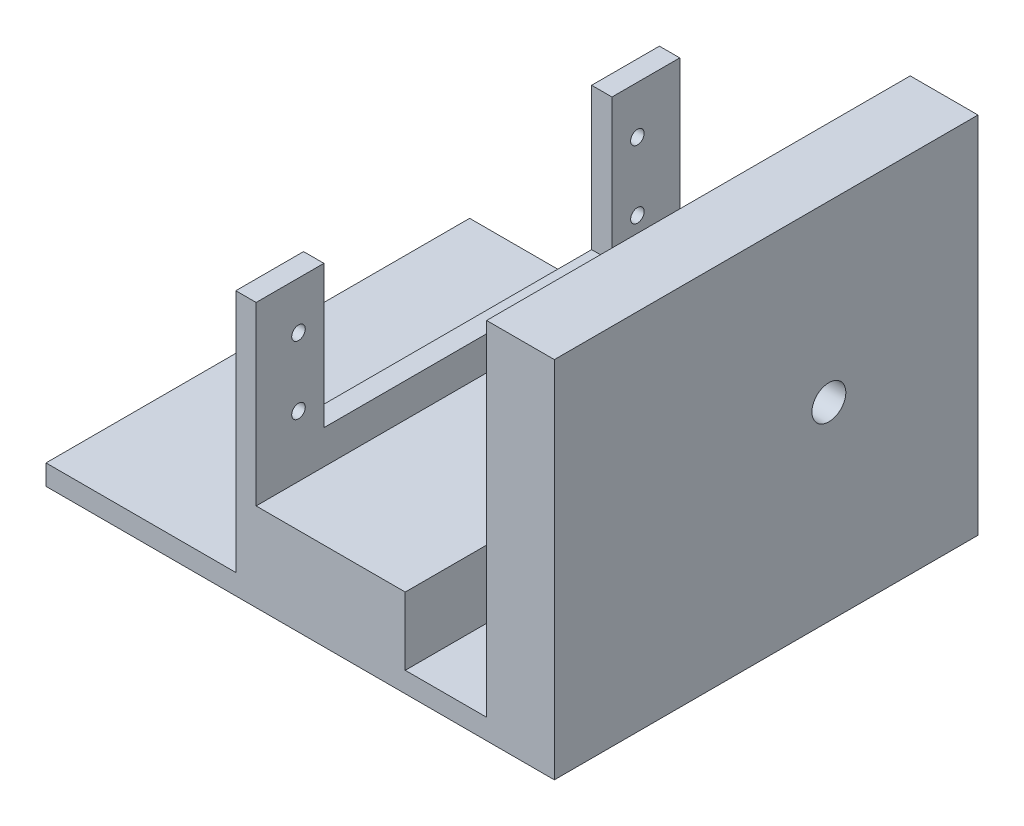
ISO-10303-21;
HEADER;
FILE_DESCRIPTION(('STEP AP214'),'2;1');
FILE_NAME('part.step','',(''),(''),'','','');
FILE_SCHEMA(('AUTOMOTIVE_DESIGN { 1 0 10303 214 1 1 1 1 }'));
ENDSEC;
DATA;
#1=APPLICATION_CONTEXT('core data for automotive mechanical design processes');
#2=APPLICATION_PROTOCOL_DEFINITION('international standard','automotive_design',2000,#1);
#3=PRODUCT_CONTEXT('',#1,'mechanical');
#4=PRODUCT('Part','Part','',(#3));
#5=PRODUCT_RELATED_PRODUCT_CATEGORY('part','',(#4));
#6=PRODUCT_DEFINITION_FORMATION('','',#4);
#7=PRODUCT_DEFINITION_CONTEXT('part definition',#1,'design');
#8=PRODUCT_DEFINITION('design','',#6,#7);
#9=PRODUCT_DEFINITION_SHAPE('','',#8);
#10=(LENGTH_UNIT() NAMED_UNIT(*) SI_UNIT(.MILLI.,.METRE.));
#11=(NAMED_UNIT(*) PLANE_ANGLE_UNIT() SI_UNIT($,.RADIAN.));
#12=(NAMED_UNIT(*) SI_UNIT($,.STERADIAN.) SOLID_ANGLE_UNIT());
#13=UNCERTAINTY_MEASURE_WITH_UNIT(LENGTH_MEASURE(1.E-05),#10,'distance_accuracy_value','');
#14=(GEOMETRIC_REPRESENTATION_CONTEXT(3) GLOBAL_UNCERTAINTY_ASSIGNED_CONTEXT((#13)) GLOBAL_UNIT_ASSIGNED_CONTEXT((#10,
#11,#12)) REPRESENTATION_CONTEXT('',''));
#15=CARTESIAN_POINT('',(0.,0.,0.));
#16=DIRECTION('',(0.,0.,1.));
#17=DIRECTION('',(1.,0.,0.));
#18=AXIS2_PLACEMENT_3D('',#15,#16,#17);
#19=CARTESIAN_POINT('',(10.,3.,0.));
#20=DIRECTION('',(0.,1.,0.));
#21=DIRECTION('',(0.,0.,1.));
#22=AXIS2_PLACEMENT_3D('',#19,#20,#21);
#23=PLANE('',#22);
#24=DIRECTION('',(-1.,0.,0.));
#25=VECTOR('',#24,1.);
#26=CARTESIAN_POINT('',(9.99999999999999,3.,-62.5));
#27=LINE('',#26,#25);
#28=CARTESIAN_POINT('',(89.,3.,-62.5));
#29=VERTEX_POINT('',#28);
#30=CARTESIAN_POINT('',(77.,3.,-62.5));
#31=VERTEX_POINT('',#30);
#32=EDGE_CURVE('E191',#29,#31,#27,.T.);
#33=ORIENTED_EDGE('',*,*,#32,.T.);
#34=DIRECTION('',(0.,0.,-1.));
#35=VECTOR('',#34,1.);
#36=CARTESIAN_POINT('',(77.,3.,-62.5));
#37=LINE('',#36,#35);
#38=CARTESIAN_POINT('',(77.,3.,0.));
#39=VERTEX_POINT('',#38);
#40=EDGE_CURVE('E218',#39,#31,#37,.T.);
#41=ORIENTED_EDGE('',*,*,#40,.F.);
#42=DIRECTION('',(1.,0.,0.));
#43=VECTOR('',#42,1.);
#44=CARTESIAN_POINT('',(10.,3.,0.));
#45=LINE('',#44,#43);
#46=CARTESIAN_POINT('',(89.,3.,0.));
#47=VERTEX_POINT('',#46);
#48=EDGE_CURVE('E195',#39,#47,#45,.T.);
#49=ORIENTED_EDGE('',*,*,#48,.T.);
#50=DIRECTION('',(0.,0.,-1.));
#51=VECTOR('',#50,1.);
#52=CARTESIAN_POINT('',(89.,3.,-62.5));
#53=LINE('',#52,#51);
#54=EDGE_CURVE('E199',#47,#29,#53,.T.);
#55=ORIENTED_EDGE('',*,*,#54,.T.);
#56=EDGE_LOOP('',(#33,#41,#49,#55));
#57=FACE_BOUND('',#56,.T.);
#58=ADVANCED_FACE('F34',(#57),#23,.T.);
#59=DIRECTION('',(0.,0.,-1.));
#60=VECTOR('',#59,1.);
#61=CARTESIAN_POINT('',(24.,3.,0.));
#62=LINE('',#61,#60);
#63=CARTESIAN_POINT('',(24.,3.,0.));
#64=VERTEX_POINT('',#63);
#65=CARTESIAN_POINT('',(24.,3.,-62.5));
#66=VERTEX_POINT('',#65);
#67=EDGE_CURVE('E162',#64,#66,#62,.T.);
#68=ORIENTED_EDGE('',*,*,#67,.F.);
#69=CARTESIAN_POINT('',(52.,3.,0.));
#70=VERTEX_POINT('',#69);
#71=EDGE_CURVE('E161',#64,#70,#45,.T.);
#72=ORIENTED_EDGE('',*,*,#71,.T.);
#73=DIRECTION('',(0.,0.,1.));
#74=VECTOR('',#73,1.);
#75=CARTESIAN_POINT('',(52.,3.,-62.5));
#76=LINE('',#75,#74);
#77=CARTESIAN_POINT('',(52.,3.,-62.5));
#78=VERTEX_POINT('',#77);
#79=EDGE_CURVE('E214',#78,#70,#76,.T.);
#80=ORIENTED_EDGE('',*,*,#79,.F.);
#81=EDGE_CURVE('E198',#78,#66,#27,.T.);
#82=ORIENTED_EDGE('',*,*,#81,.T.);
#83=EDGE_LOOP('',(#68,#72,#80,#82));
#84=FACE_BOUND('',#83,.T.);
#85=ADVANCED_FACE('F323',(#84),#23,.T.);
#86=CARTESIAN_POINT('',(0.,53.7,0.));
#87=DIRECTION('',(0.,0.,-1.));
#88=DIRECTION('',(-1.,0.,0.));
#89=AXIS2_PLACEMENT_3D('',#86,#87,#88);
#90=PLANE('',#89);
#91=ORIENTED_EDGE('',*,*,#71,.F.);
#92=DIRECTION('',(0.,-1.,0.));
#93=VECTOR('',#92,1.);
#94=CARTESIAN_POINT('',(24.,72.,0.));
#95=LINE('',#94,#93);
#96=CARTESIAN_POINT('',(24.,0.,0.));
#97=VERTEX_POINT('',#96);
#98=EDGE_CURVE('E148',#64,#97,#95,.T.);
#99=ORIENTED_EDGE('',*,*,#98,.T.);
#100=DIRECTION('',(1.,0.,0.));
#101=VECTOR('',#100,1.);
#102=CARTESIAN_POINT('',(0.,0.,0.));
#103=LINE('',#102,#101);
#104=CARTESIAN_POINT('',(99.,0.,0.));
#105=VERTEX_POINT('',#104);
#106=EDGE_CURVE('E159',#97,#105,#103,.T.);
#107=ORIENTED_EDGE('',*,*,#106,.T.);
#108=DIRECTION('',(0.,-1.,0.));
#109=VECTOR('',#108,1.);
#110=CARTESIAN_POINT('',(99.,53.7,0.));
#111=LINE('',#110,#109);
#112=CARTESIAN_POINT('',(99.,53.7,0.));
#113=VERTEX_POINT('',#112);
#114=EDGE_CURVE('E11',#113,#105,#111,.T.);
#115=ORIENTED_EDGE('',*,*,#114,.F.);
#116=DIRECTION('',(1.,0.,0.));
#117=VECTOR('',#116,1.);
#118=CARTESIAN_POINT('',(0.,53.7,0.));
#119=LINE('',#118,#117);
#120=CARTESIAN_POINT('',(89.,53.7,0.));
#121=VERTEX_POINT('',#120);
#122=EDGE_CURVE('E179',#121,#113,#119,.T.);
#123=ORIENTED_EDGE('',*,*,#122,.F.);
#124=DIRECTION('',(0.,1.,0.));
#125=VECTOR('',#124,1.);
#126=CARTESIAN_POINT('',(89.,3.,0.));
#127=LINE('',#126,#125);
#128=EDGE_CURVE('E172',#47,#121,#127,.T.);
#129=ORIENTED_EDGE('',*,*,#128,.F.);
#130=ORIENTED_EDGE('',*,*,#48,.F.);
#131=DIRECTION('',(0.,-1.,0.));
#132=VECTOR('',#131,1.);
#133=CARTESIAN_POINT('',(77.,13.,0.));
#134=LINE('',#133,#132);
#135=CARTESIAN_POINT('',(77.,13.,0.));
#136=VERTEX_POINT('',#135);
#137=EDGE_CURVE('E210',#136,#39,#134,.T.);
#138=ORIENTED_EDGE('',*,*,#137,.F.);
#139=DIRECTION('',(1.,0.,0.));
#140=VECTOR('',#139,1.);
#141=CARTESIAN_POINT('',(77.,13.,0.));
#142=LINE('',#141,#140);
#143=CARTESIAN_POINT('',(55.,13.,0.));
#144=VERTEX_POINT('',#143);
#145=EDGE_CURVE('E213',#144,#136,#142,.T.);
#146=ORIENTED_EDGE('',*,*,#145,.F.);
#147=DIRECTION('',(0.,1.,0.));
#148=VECTOR('',#147,1.);
#149=CARTESIAN_POINT('',(55.,39.,0.));
#150=LINE('',#149,#148);
#151=CARTESIAN_POINT('',(55.,39.,0.));
#152=VERTEX_POINT('',#151);
#153=EDGE_CURVE('E273',#144,#152,#150,.T.);
#154=ORIENTED_EDGE('',*,*,#153,.T.);
#155=DIRECTION('',(-1.,0.,0.));
#156=VECTOR('',#155,1.);
#157=CARTESIAN_POINT('',(55.,39.,0.));
#158=LINE('',#157,#156);
#159=CARTESIAN_POINT('',(52.,39.,0.));
#160=VERTEX_POINT('',#159);
#161=EDGE_CURVE('E227',#152,#160,#158,.T.);
#162=ORIENTED_EDGE('',*,*,#161,.T.);
#163=DIRECTION('',(0.,-1.,0.));
#164=VECTOR('',#163,1.);
#165=CARTESIAN_POINT('',(52.,13.,0.));
#166=LINE('',#165,#164);
#167=EDGE_CURVE('E208',#160,#70,#166,.T.);
#168=ORIENTED_EDGE('',*,*,#167,.T.);
#169=EDGE_LOOP('',(#91,#99,#107,#115,#123,#129,#130,#138,#146,#154,#162,#168));
#170=FACE_BOUND('',#169,.T.);
#171=ADVANCED_FACE('F36',(#170),#90,.F.);
#172=CARTESIAN_POINT('',(99.,53.7,0.));
#173=DIRECTION('',(-1.,0.,0.));
#174=DIRECTION('',(0.,0.,1.));
#175=AXIS2_PLACEMENT_3D('',#172,#173,#174);
#176=PLANE('',#175);
#177=CARTESIAN_POINT('',(99.,28.,-40.5));
#178=DIRECTION('',(1.,0.,0.));
#179=DIRECTION('',(0.,0.,-1.));
#180=AXIS2_PLACEMENT_3D('',#177,#178,#179);
#181=CIRCLE('',#180,2.5);
#182=CARTESIAN_POINT('',(99.,28.,-43.));
#183=VERTEX_POINT('',#182);
#184=EDGE_CURVE('E302',#183,#183,#181,.T.);
#185=ORIENTED_EDGE('',*,*,#184,.F.);
#186=EDGE_LOOP('',(#185));
#187=FACE_BOUND('',#186,.T.);
#188=DIRECTION('',(0.,0.,-1.));
#189=VECTOR('',#188,1.);
#190=CARTESIAN_POINT('',(99.,0.,0.));
#191=LINE('',#190,#189);
#192=CARTESIAN_POINT('',(99.,0.,-62.5));
#193=VERTEX_POINT('',#192);
#194=EDGE_CURVE('E166',#105,#193,#191,.T.);
#195=ORIENTED_EDGE('',*,*,#194,.T.);
#196=DIRECTION('',(0.,-1.,0.));
#197=VECTOR('',#196,1.);
#198=CARTESIAN_POINT('',(99.,53.7,-62.5));
#199=LINE('',#198,#197);
#200=CARTESIAN_POINT('',(99.,53.7,-62.5));
#201=VERTEX_POINT('',#200);
#202=EDGE_CURVE('E43',#201,#193,#199,.T.);
#203=ORIENTED_EDGE('',*,*,#202,.F.);
#204=DIRECTION('',(0.,0.,-1.));
#205=VECTOR('',#204,1.);
#206=CARTESIAN_POINT('',(99.,53.7,0.));
#207=LINE('',#206,#205);
#208=EDGE_CURVE('E185',#113,#201,#207,.T.);
#209=ORIENTED_EDGE('',*,*,#208,.F.);
#210=ORIENTED_EDGE('',*,*,#114,.T.);
#211=EDGE_LOOP('',(#195,#203,#209,#210));
#212=FACE_BOUND('',#211,.T.);
#213=ADVANCED_FACE('F343',(#187,#212),#176,.F.);
#214=CARTESIAN_POINT('',(0.,53.7,-62.5));
#215=DIRECTION('',(0.,0.,1.));
#216=DIRECTION('',(1.,0.,0.));
#217=AXIS2_PLACEMENT_3D('',#214,#215,#216);
#218=PLANE('',#217);
#219=DIRECTION('',(-1.,0.,0.));
#220=VECTOR('',#219,1.);
#221=CARTESIAN_POINT('',(0.,0.,-62.5));
#222=LINE('',#221,#220);
#223=CARTESIAN_POINT('',(24.,0.,-62.5));
#224=VERTEX_POINT('',#223);
#225=EDGE_CURVE('E169',#193,#224,#222,.T.);
#226=ORIENTED_EDGE('',*,*,#225,.T.);
#227=DIRECTION('',(0.,-1.,0.));
#228=VECTOR('',#227,1.);
#229=CARTESIAN_POINT('',(24.,72.,-62.5));
#230=LINE('',#229,#228);
#231=EDGE_CURVE('E50',#66,#224,#230,.T.);
#232=ORIENTED_EDGE('',*,*,#231,.F.);
#233=ORIENTED_EDGE('',*,*,#81,.F.);
#234=DIRECTION('',(0.,-1.,0.));
#235=VECTOR('',#234,1.);
#236=CARTESIAN_POINT('',(52.,13.,-62.5));
#237=LINE('',#236,#235);
#238=CARTESIAN_POINT('',(52.,39.,-62.5));
#239=VERTEX_POINT('',#238);
#240=EDGE_CURVE('E205',#239,#78,#237,.T.);
#241=ORIENTED_EDGE('',*,*,#240,.F.);
#242=DIRECTION('',(-1.,0.,0.));
#243=VECTOR('',#242,1.);
#244=CARTESIAN_POINT('',(55.,39.,-62.5));
#245=LINE('',#244,#243);
#246=CARTESIAN_POINT('',(55.,39.,-62.5));
#247=VERTEX_POINT('',#246);
#248=EDGE_CURVE('E221',#247,#239,#245,.T.);
#249=ORIENTED_EDGE('',*,*,#248,.F.);
#250=DIRECTION('',(0.,-1.,0.));
#251=VECTOR('',#250,1.);
#252=CARTESIAN_POINT('',(55.,13.,-62.5));
#253=LINE('',#252,#251);
#254=CARTESIAN_POINT('',(55.,13.,-62.5));
#255=VERTEX_POINT('',#254);
#256=EDGE_CURVE('E231',#247,#255,#253,.T.);
#257=ORIENTED_EDGE('',*,*,#256,.T.);
#258=DIRECTION('',(-1.,0.,0.));
#259=VECTOR('',#258,1.);
#260=CARTESIAN_POINT('',(77.,13.,-62.5));
#261=LINE('',#260,#259);
#262=CARTESIAN_POINT('',(77.,13.,-62.5));
#263=VERTEX_POINT('',#262);
#264=EDGE_CURVE('E223',#263,#255,#261,.T.);
#265=ORIENTED_EDGE('',*,*,#264,.F.);
#266=DIRECTION('',(0.,-1.,0.));
#267=VECTOR('',#266,1.);
#268=CARTESIAN_POINT('',(77.,13.,-62.5));
#269=LINE('',#268,#267);
#270=EDGE_CURVE('E196',#263,#31,#269,.T.);
#271=ORIENTED_EDGE('',*,*,#270,.T.);
#272=ORIENTED_EDGE('',*,*,#32,.F.);
#273=DIRECTION('',(0.,1.,0.));
#274=VECTOR('',#273,1.);
#275=CARTESIAN_POINT('',(89.,3.,-62.5));
#276=LINE('',#275,#274);
#277=CARTESIAN_POINT('',(89.,53.7,-62.5));
#278=VERTEX_POINT('',#277);
#279=EDGE_CURVE('E167',#29,#278,#276,.T.);
#280=ORIENTED_EDGE('',*,*,#279,.T.);
#281=DIRECTION('',(-1.,0.,0.));
#282=VECTOR('',#281,1.);
#283=CARTESIAN_POINT('',(0.,53.7,-62.5));
#284=LINE('',#283,#282);
#285=EDGE_CURVE('E175',#201,#278,#284,.T.);
#286=ORIENTED_EDGE('',*,*,#285,.F.);
#287=ORIENTED_EDGE('',*,*,#202,.T.);
#288=EDGE_LOOP('',(#226,#232,#233,#241,#249,#257,#265,#271,#272,#280,#286,#287));
#289=FACE_BOUND('',#288,.T.);
#290=ADVANCED_FACE('F339',(#289),#218,.F.);
#291=CARTESIAN_POINT('',(0.,53.7,-62.5));
#292=DIRECTION('',(0.,-1.,0.));
#293=DIRECTION('',(0.,0.,-1.));
#294=AXIS2_PLACEMENT_3D('',#291,#292,#293);
#295=PLANE('',#294);
#296=ORIENTED_EDGE('',*,*,#285,.T.);
#297=DIRECTION('',(0.,0.,-1.));
#298=VECTOR('',#297,1.);
#299=CARTESIAN_POINT('',(89.,53.7,-62.5));
#300=LINE('',#299,#298);
#301=EDGE_CURVE('E193',#121,#278,#300,.T.);
#302=ORIENTED_EDGE('',*,*,#301,.F.);
#303=ORIENTED_EDGE('',*,*,#122,.T.);
#304=ORIENTED_EDGE('',*,*,#208,.T.);
#305=EDGE_LOOP('',(#296,#302,#303,#304));
#306=FACE_BOUND('',#305,.T.);
#307=ADVANCED_FACE('F336',(#306),#295,.F.);
#308=CARTESIAN_POINT('',(0.,0.,-62.5));
#309=DIRECTION('',(0.,-1.,0.));
#310=DIRECTION('',(0.,0.,-1.));
#311=AXIS2_PLACEMENT_3D('',#308,#309,#310);
#312=PLANE('',#311);
#313=DIRECTION('',(0.,0.,1.));
#314=VECTOR('',#313,1.);
#315=CARTESIAN_POINT('',(24.,0.,0.));
#316=LINE('',#315,#314);
#317=EDGE_CURVE('E145',#224,#97,#316,.T.);
#318=ORIENTED_EDGE('',*,*,#317,.F.);
#319=ORIENTED_EDGE('',*,*,#225,.F.);
#320=ORIENTED_EDGE('',*,*,#194,.F.);
#321=ORIENTED_EDGE('',*,*,#106,.F.);
#322=EDGE_LOOP('',(#318,#319,#320,#321));
#323=FACE_BOUND('',#322,.T.);
#324=ADVANCED_FACE('F165',(#323),#312,.T.);
#325=CARTESIAN_POINT('',(89.,3.,-62.5));
#326=DIRECTION('',(1.,0.,0.));
#327=DIRECTION('',(0.,0.,-1.));
#328=AXIS2_PLACEMENT_3D('',#325,#326,#327);
#329=PLANE('',#328);
#330=CARTESIAN_POINT('',(89.,28.,-40.5));
#331=DIRECTION('',(1.,0.,0.));
#332=DIRECTION('',(0.,0.,-1.));
#333=AXIS2_PLACEMENT_3D('',#330,#331,#332);
#334=CIRCLE('',#333,2.5);
#335=CARTESIAN_POINT('',(89.,28.,-43.));
#336=VERTEX_POINT('',#335);
#337=EDGE_CURVE('E38',#336,#336,#334,.T.);
#338=ORIENTED_EDGE('',*,*,#337,.T.);
#339=EDGE_LOOP('',(#338));
#340=FACE_BOUND('',#339,.T.);
#341=ORIENTED_EDGE('',*,*,#301,.T.);
#342=ORIENTED_EDGE('',*,*,#279,.F.);
#343=ORIENTED_EDGE('',*,*,#54,.F.);
#344=ORIENTED_EDGE('',*,*,#128,.T.);
#345=EDGE_LOOP('',(#341,#342,#343,#344));
#346=FACE_BOUND('',#345,.T.);
#347=ADVANCED_FACE('F309',(#340,#346),#329,.F.);
#348=CARTESIAN_POINT('',(77.,13.,-62.5));
#349=DIRECTION('',(-1.,0.,0.));
#350=DIRECTION('',(0.,0.,1.));
#351=AXIS2_PLACEMENT_3D('',#348,#349,#350);
#352=PLANE('',#351);
#353=ORIENTED_EDGE('',*,*,#40,.T.);
#354=ORIENTED_EDGE('',*,*,#270,.F.);
#355=DIRECTION('',(0.,0.,-1.));
#356=VECTOR('',#355,1.);
#357=CARTESIAN_POINT('',(77.,13.,-62.5));
#358=LINE('',#357,#356);
#359=EDGE_CURVE('E217',#136,#263,#358,.T.);
#360=ORIENTED_EDGE('',*,*,#359,.F.);
#361=ORIENTED_EDGE('',*,*,#137,.T.);
#362=EDGE_LOOP('',(#353,#354,#360,#361));
#363=FACE_BOUND('',#362,.T.);
#364=ADVANCED_FACE('F332',(#363),#352,.F.);
#365=CARTESIAN_POINT('',(52.,13.,-62.5));
#366=DIRECTION('',(1.,0.,0.));
#367=DIRECTION('',(0.,0.,-1.));
#368=AXIS2_PLACEMENT_3D('',#365,#366,#367);
#369=PLANE('',#368);
#370=CARTESIAN_POINT('',(52.,32.,-6.25000000000001));
#371=DIRECTION('',(-1.,0.,0.));
#372=DIRECTION('',(0.,0.,1.));
#373=AXIS2_PLACEMENT_3D('',#370,#371,#372);
#374=CIRCLE('',#373,1.);
#375=CARTESIAN_POINT('',(52.,32.,-5.25000000000001));
#376=VERTEX_POINT('',#375);
#377=EDGE_CURVE('E297',#376,#376,#374,.T.);
#378=ORIENTED_EDGE('',*,*,#377,.F.);
#379=EDGE_LOOP('',(#378));
#380=FACE_BOUND('',#379,.T.);
#381=CARTESIAN_POINT('',(52.,22.,-6.25000000000001));
#382=DIRECTION('',(-1.,0.,0.));
#383=DIRECTION('',(0.,0.,1.));
#384=AXIS2_PLACEMENT_3D('',#381,#382,#383);
#385=CIRCLE('',#384,0.999999999999999);
#386=CARTESIAN_POINT('',(52.,22.,-5.25000000000001));
#387=VERTEX_POINT('',#386);
#388=EDGE_CURVE('E291',#387,#387,#385,.T.);
#389=ORIENTED_EDGE('',*,*,#388,.F.);
#390=EDGE_LOOP('',(#389));
#391=FACE_BOUND('',#390,.T.);
#392=CARTESIAN_POINT('',(52.,22.,-56.25));
#393=DIRECTION('',(-1.,0.,0.));
#394=DIRECTION('',(0.,0.,1.));
#395=AXIS2_PLACEMENT_3D('',#392,#393,#394);
#396=CIRCLE('',#395,0.999999999999998);
#397=CARTESIAN_POINT('',(52.,22.,-55.25));
#398=VERTEX_POINT('',#397);
#399=EDGE_CURVE('E285',#398,#398,#396,.T.);
#400=ORIENTED_EDGE('',*,*,#399,.F.);
#401=EDGE_LOOP('',(#400));
#402=FACE_BOUND('',#401,.T.);
#403=CARTESIAN_POINT('',(52.,32.,-56.25));
#404=DIRECTION('',(-1.,0.,0.));
#405=DIRECTION('',(0.,0.,1.));
#406=AXIS2_PLACEMENT_3D('',#403,#404,#405);
#407=CIRCLE('',#406,0.999999999999998);
#408=CARTESIAN_POINT('',(52.,32.,-55.25));
#409=VERTEX_POINT('',#408);
#410=EDGE_CURVE('E279',#409,#409,#407,.T.);
#411=ORIENTED_EDGE('',*,*,#410,.F.);
#412=EDGE_LOOP('',(#411));
#413=FACE_BOUND('',#412,.T.);
#414=ORIENTED_EDGE('',*,*,#79,.T.);
#415=ORIENTED_EDGE('',*,*,#167,.F.);
#416=DIRECTION('',(0.,0.,-1.));
#417=VECTOR('',#416,1.);
#418=CARTESIAN_POINT('',(52.,39.,-10.));
#419=LINE('',#418,#417);
#420=CARTESIAN_POINT('',(52.,39.,-10.));
#421=VERTEX_POINT('',#420);
#422=EDGE_CURVE('E253',#160,#421,#419,.T.);
#423=ORIENTED_EDGE('',*,*,#422,.T.);
#424=DIRECTION('',(0.,-1.,0.));
#425=VECTOR('',#424,1.);
#426=CARTESIAN_POINT('',(52.,18.,-10.));
#427=LINE('',#426,#425);
#428=CARTESIAN_POINT('',(52.,18.,-10.));
#429=VERTEX_POINT('',#428);
#430=EDGE_CURVE('E250',#421,#429,#427,.T.);
#431=ORIENTED_EDGE('',*,*,#430,.T.);
#432=DIRECTION('',(0.,0.,-1.));
#433=VECTOR('',#432,1.);
#434=CARTESIAN_POINT('',(52.,18.,-52.5));
#435=LINE('',#434,#433);
#436=CARTESIAN_POINT('',(52.,18.,-52.5));
#437=VERTEX_POINT('',#436);
#438=EDGE_CURVE('E247',#429,#437,#435,.T.);
#439=ORIENTED_EDGE('',*,*,#438,.T.);
#440=DIRECTION('',(0.,1.,0.));
#441=VECTOR('',#440,1.);
#442=CARTESIAN_POINT('',(52.,39.,-52.5));
#443=LINE('',#442,#441);
#444=CARTESIAN_POINT('',(52.,39.,-52.5));
#445=VERTEX_POINT('',#444);
#446=EDGE_CURVE('E244',#437,#445,#443,.T.);
#447=ORIENTED_EDGE('',*,*,#446,.T.);
#448=DIRECTION('',(0.,0.,-1.));
#449=VECTOR('',#448,1.);
#450=CARTESIAN_POINT('',(52.,39.,-62.5));
#451=LINE('',#450,#449);
#452=EDGE_CURVE('E241',#445,#239,#451,.T.);
#453=ORIENTED_EDGE('',*,*,#452,.T.);
#454=ORIENTED_EDGE('',*,*,#240,.T.);
#455=EDGE_LOOP('',(#414,#415,#423,#431,#439,#447,#453,#454));
#456=FACE_BOUND('',#455,.T.);
#457=ADVANCED_FACE('F386',(#380,#391,#402,#413,#456),#369,.F.);
#458=CARTESIAN_POINT('',(77.,13.,0.));
#459=DIRECTION('',(0.,-1.,0.));
#460=DIRECTION('',(0.,0.,-1.));
#461=AXIS2_PLACEMENT_3D('',#458,#459,#460);
#462=PLANE('',#461);
#463=ORIENTED_EDGE('',*,*,#264,.T.);
#464=DIRECTION('',(0.,0.,1.));
#465=VECTOR('',#464,1.);
#466=CARTESIAN_POINT('',(55.,13.,0.));
#467=LINE('',#466,#465);
#468=EDGE_CURVE('E58',#255,#144,#467,.T.);
#469=ORIENTED_EDGE('',*,*,#468,.T.);
#470=ORIENTED_EDGE('',*,*,#145,.T.);
#471=ORIENTED_EDGE('',*,*,#359,.T.);
#472=EDGE_LOOP('',(#463,#469,#470,#471));
#473=FACE_BOUND('',#472,.T.);
#474=ADVANCED_FACE('F360',(#473),#462,.F.);
#475=CARTESIAN_POINT('',(55.,39.,-62.5));
#476=DIRECTION('',(0.,1.,0.));
#477=DIRECTION('',(0.,0.,1.));
#478=AXIS2_PLACEMENT_3D('',#475,#476,#477);
#479=PLANE('',#478);
#480=ORIENTED_EDGE('',*,*,#452,.F.);
#481=DIRECTION('',(-1.,0.,0.));
#482=VECTOR('',#481,1.);
#483=CARTESIAN_POINT('',(55.,39.,-52.5));
#484=LINE('',#483,#482);
#485=CARTESIAN_POINT('',(55.,39.,-52.5));
#486=VERTEX_POINT('',#485);
#487=EDGE_CURVE('E237',#486,#445,#484,.T.);
#488=ORIENTED_EDGE('',*,*,#487,.F.);
#489=DIRECTION('',(0.,0.,-1.));
#490=VECTOR('',#489,1.);
#491=CARTESIAN_POINT('',(55.,39.,-62.5));
#492=LINE('',#491,#490);
#493=EDGE_CURVE('E258',#486,#247,#492,.T.);
#494=ORIENTED_EDGE('',*,*,#493,.T.);
#495=ORIENTED_EDGE('',*,*,#248,.T.);
#496=EDGE_LOOP('',(#480,#488,#494,#495));
#497=FACE_BOUND('',#496,.T.);
#498=ADVANCED_FACE('F369',(#497),#479,.T.);
#499=CARTESIAN_POINT('',(55.,39.,-52.5));
#500=DIRECTION('',(0.,0.,1.));
#501=DIRECTION('',(0.,-1.,0.));
#502=AXIS2_PLACEMENT_3D('',#499,#500,#501);
#503=PLANE('',#502);
#504=ORIENTED_EDGE('',*,*,#446,.F.);
#505=DIRECTION('',(-1.,0.,0.));
#506=VECTOR('',#505,1.);
#507=CARTESIAN_POINT('',(55.,18.,-52.5));
#508=LINE('',#507,#506);
#509=CARTESIAN_POINT('',(55.,18.,-52.5));
#510=VERTEX_POINT('',#509);
#511=EDGE_CURVE('E235',#510,#437,#508,.T.);
#512=ORIENTED_EDGE('',*,*,#511,.F.);
#513=DIRECTION('',(0.,1.,0.));
#514=VECTOR('',#513,1.);
#515=CARTESIAN_POINT('',(55.,39.,-52.5));
#516=LINE('',#515,#514);
#517=EDGE_CURVE('E261',#510,#486,#516,.T.);
#518=ORIENTED_EDGE('',*,*,#517,.T.);
#519=ORIENTED_EDGE('',*,*,#487,.T.);
#520=EDGE_LOOP('',(#504,#512,#518,#519));
#521=FACE_BOUND('',#520,.T.);
#522=ADVANCED_FACE('F374',(#521),#503,.T.);
#523=CARTESIAN_POINT('',(55.,18.,-52.5));
#524=DIRECTION('',(0.,1.,0.));
#525=DIRECTION('',(0.,0.,1.));
#526=AXIS2_PLACEMENT_3D('',#523,#524,#525);
#527=PLANE('',#526);
#528=ORIENTED_EDGE('',*,*,#438,.F.);
#529=DIRECTION('',(-1.,0.,0.));
#530=VECTOR('',#529,1.);
#531=CARTESIAN_POINT('',(55.,18.,-10.));
#532=LINE('',#531,#530);
#533=CARTESIAN_POINT('',(55.,18.,-10.));
#534=VERTEX_POINT('',#533);
#535=EDGE_CURVE('E233',#534,#429,#532,.T.);
#536=ORIENTED_EDGE('',*,*,#535,.F.);
#537=DIRECTION('',(0.,0.,-1.));
#538=VECTOR('',#537,1.);
#539=CARTESIAN_POINT('',(55.,18.,-52.5));
#540=LINE('',#539,#538);
#541=EDGE_CURVE('E264',#534,#510,#540,.T.);
#542=ORIENTED_EDGE('',*,*,#541,.T.);
#543=ORIENTED_EDGE('',*,*,#511,.T.);
#544=EDGE_LOOP('',(#528,#536,#542,#543));
#545=FACE_BOUND('',#544,.T.);
#546=ADVANCED_FACE('F377',(#545),#527,.T.);
#547=CARTESIAN_POINT('',(55.,18.,-10.));
#548=DIRECTION('',(0.,0.,-1.));
#549=DIRECTION('',(-1.,0.,0.));
#550=AXIS2_PLACEMENT_3D('',#547,#548,#549);
#551=PLANE('',#550);
#552=ORIENTED_EDGE('',*,*,#430,.F.);
#553=DIRECTION('',(-1.,0.,0.));
#554=VECTOR('',#553,1.);
#555=CARTESIAN_POINT('',(55.,39.,-10.));
#556=LINE('',#555,#554);
#557=CARTESIAN_POINT('',(55.,39.,-10.));
#558=VERTEX_POINT('',#557);
#559=EDGE_CURVE('E230',#558,#421,#556,.T.);
#560=ORIENTED_EDGE('',*,*,#559,.F.);
#561=DIRECTION('',(0.,-1.,0.));
#562=VECTOR('',#561,1.);
#563=CARTESIAN_POINT('',(55.,18.,-10.));
#564=LINE('',#563,#562);
#565=EDGE_CURVE('E267',#558,#534,#564,.T.);
#566=ORIENTED_EDGE('',*,*,#565,.T.);
#567=ORIENTED_EDGE('',*,*,#535,.T.);
#568=EDGE_LOOP('',(#552,#560,#566,#567));
#569=FACE_BOUND('',#568,.T.);
#570=ADVANCED_FACE('F381',(#569),#551,.T.);
#571=CARTESIAN_POINT('',(55.,39.,-10.));
#572=DIRECTION('',(0.,1.,0.));
#573=DIRECTION('',(0.,0.,1.));
#574=AXIS2_PLACEMENT_3D('',#571,#572,#573);
#575=PLANE('',#574);
#576=ORIENTED_EDGE('',*,*,#422,.F.);
#577=ORIENTED_EDGE('',*,*,#161,.F.);
#578=DIRECTION('',(0.,0.,-1.));
#579=VECTOR('',#578,1.);
#580=CARTESIAN_POINT('',(55.,39.,-10.));
#581=LINE('',#580,#579);
#582=EDGE_CURVE('E270',#152,#558,#581,.T.);
#583=ORIENTED_EDGE('',*,*,#582,.T.);
#584=ORIENTED_EDGE('',*,*,#559,.T.);
#585=EDGE_LOOP('',(#576,#577,#583,#584));
#586=FACE_BOUND('',#585,.T.);
#587=ADVANCED_FACE('F384',(#586),#575,.T.);
#588=CARTESIAN_POINT('',(55.,13.,-62.5));
#589=DIRECTION('',(1.,0.,0.));
#590=DIRECTION('',(0.,0.,-1.));
#591=AXIS2_PLACEMENT_3D('',#588,#589,#590);
#592=PLANE('',#591);
#593=CARTESIAN_POINT('',(55.,32.,-6.25000000000001));
#594=DIRECTION('',(1.,0.,0.));
#595=DIRECTION('',(0.,0.,-1.));
#596=AXIS2_PLACEMENT_3D('',#593,#594,#595);
#597=CIRCLE('',#596,1.);
#598=CARTESIAN_POINT('',(55.,32.,-5.25000000000001));
#599=VERTEX_POINT('',#598);
#600=EDGE_CURVE('E294',#599,#599,#597,.F.);
#601=ORIENTED_EDGE('',*,*,#600,.T.);
#602=EDGE_LOOP('',(#601));
#603=FACE_BOUND('',#602,.T.);
#604=CARTESIAN_POINT('',(55.,22.,-6.25000000000001));
#605=DIRECTION('',(1.,0.,0.));
#606=DIRECTION('',(0.,0.,-1.));
#607=AXIS2_PLACEMENT_3D('',#604,#605,#606);
#608=CIRCLE('',#607,0.999999999999999);
#609=CARTESIAN_POINT('',(55.,22.,-5.25000000000001));
#610=VERTEX_POINT('',#609);
#611=EDGE_CURVE('E288',#610,#610,#608,.F.);
#612=ORIENTED_EDGE('',*,*,#611,.T.);
#613=EDGE_LOOP('',(#612));
#614=FACE_BOUND('',#613,.T.);
#615=CARTESIAN_POINT('',(55.,22.,-56.25));
#616=DIRECTION('',(1.,0.,0.));
#617=DIRECTION('',(0.,0.,-1.));
#618=AXIS2_PLACEMENT_3D('',#615,#616,#617);
#619=CIRCLE('',#618,0.999999999999998);
#620=CARTESIAN_POINT('',(55.,22.,-55.25));
#621=VERTEX_POINT('',#620);
#622=EDGE_CURVE('E282',#621,#621,#619,.F.);
#623=ORIENTED_EDGE('',*,*,#622,.T.);
#624=EDGE_LOOP('',(#623));
#625=FACE_BOUND('',#624,.T.);
#626=CARTESIAN_POINT('',(55.,32.,-56.25));
#627=DIRECTION('',(1.,0.,0.));
#628=DIRECTION('',(0.,0.,-1.));
#629=AXIS2_PLACEMENT_3D('',#626,#627,#628);
#630=CIRCLE('',#629,0.999999999999998);
#631=CARTESIAN_POINT('',(55.,32.,-55.25));
#632=VERTEX_POINT('',#631);
#633=EDGE_CURVE('E154',#632,#632,#630,.F.);
#634=ORIENTED_EDGE('',*,*,#633,.T.);
#635=EDGE_LOOP('',(#634));
#636=FACE_BOUND('',#635,.T.);
#637=ORIENTED_EDGE('',*,*,#468,.F.);
#638=ORIENTED_EDGE('',*,*,#256,.F.);
#639=ORIENTED_EDGE('',*,*,#493,.F.);
#640=ORIENTED_EDGE('',*,*,#517,.F.);
#641=ORIENTED_EDGE('',*,*,#541,.F.);
#642=ORIENTED_EDGE('',*,*,#565,.F.);
#643=ORIENTED_EDGE('',*,*,#582,.F.);
#644=ORIENTED_EDGE('',*,*,#153,.F.);
#645=EDGE_LOOP('',(#637,#638,#639,#640,#641,#642,#643,#644));
#646=FACE_BOUND('',#645,.T.);
#647=ADVANCED_FACE('F363',(#603,#614,#625,#636,#646),#592,.T.);
#648=CARTESIAN_POINT('',(24.,72.,0.));
#649=DIRECTION('',(1.,0.,0.));
#650=DIRECTION('',(0.,0.,-1.));
#651=AXIS2_PLACEMENT_3D('',#648,#649,#650);
#652=PLANE('',#651);
#653=ORIENTED_EDGE('',*,*,#67,.T.);
#654=ORIENTED_EDGE('',*,*,#231,.T.);
#655=ORIENTED_EDGE('',*,*,#317,.T.);
#656=ORIENTED_EDGE('',*,*,#98,.F.);
#657=EDGE_LOOP('',(#653,#654,#655,#656));
#658=FACE_BOUND('',#657,.T.);
#659=ADVANCED_FACE('F147',(#658),#652,.F.);
#660=CARTESIAN_POINT('',(99.001,32.,-56.25));
#661=DIRECTION('',(-1.,0.,0.));
#662=DIRECTION('',(0.,0.,1.));
#663=AXIS2_PLACEMENT_3D('',#660,#661,#662);
#664=CYLINDRICAL_SURFACE('',#663,0.999999999999998);
#665=CARTESIAN_POINT('',(55.,32.,-55.25));
#666=CARTESIAN_POINT('',(54.96875,32.,-55.25));
#667=CARTESIAN_POINT('',(54.9375,32.,-55.25));
#668=CARTESIAN_POINT('',(54.875,32.,-55.25));
#669=CARTESIAN_POINT('',(54.84375,32.,-55.25));
#670=CARTESIAN_POINT('',(54.78125,32.,-55.25));
#671=CARTESIAN_POINT('',(54.75,32.,-55.25));
#672=CARTESIAN_POINT('',(54.6875,32.,-55.25));
#673=CARTESIAN_POINT('',(54.65625,32.,-55.25));
#674=CARTESIAN_POINT('',(54.59375,32.,-55.25));
#675=CARTESIAN_POINT('',(54.5625,32.,-55.25));
#676=CARTESIAN_POINT('',(54.5,32.,-55.25));
#677=CARTESIAN_POINT('',(54.46875,32.,-55.25));
#678=CARTESIAN_POINT('',(54.40625,32.,-55.25));
#679=CARTESIAN_POINT('',(54.375,32.,-55.25));
#680=CARTESIAN_POINT('',(54.3125,32.,-55.25));
#681=CARTESIAN_POINT('',(54.28125,32.,-55.25));
#682=CARTESIAN_POINT('',(54.21875,32.,-55.25));
#683=CARTESIAN_POINT('',(54.1875,32.,-55.25));
#684=CARTESIAN_POINT('',(54.125,32.,-55.25));
#685=CARTESIAN_POINT('',(54.09375,32.,-55.25));
#686=CARTESIAN_POINT('',(54.03125,32.,-55.25));
#687=CARTESIAN_POINT('',(54.,32.,-55.25));
#688=CARTESIAN_POINT('',(53.9375,32.,-55.25));
#689=CARTESIAN_POINT('',(53.90625,32.,-55.25));
#690=CARTESIAN_POINT('',(53.84375,32.,-55.25));
#691=CARTESIAN_POINT('',(53.8125,32.,-55.25));
#692=CARTESIAN_POINT('',(53.75,32.,-55.25));
#693=CARTESIAN_POINT('',(53.71875,32.,-55.25));
#694=CARTESIAN_POINT('',(53.65625,32.,-55.25));
#695=CARTESIAN_POINT('',(53.625,32.,-55.25));
#696=CARTESIAN_POINT('',(53.5625,32.,-55.25));
#697=CARTESIAN_POINT('',(53.53125,32.,-55.25));
#698=CARTESIAN_POINT('',(53.46875,32.,-55.25));
#699=CARTESIAN_POINT('',(53.4375,32.,-55.25));
#700=CARTESIAN_POINT('',(53.375,32.,-55.25));
#701=CARTESIAN_POINT('',(53.34375,32.,-55.25));
#702=CARTESIAN_POINT('',(53.28125,32.,-55.25));
#703=CARTESIAN_POINT('',(53.25,32.,-55.25));
#704=CARTESIAN_POINT('',(53.1875,32.,-55.25));
#705=CARTESIAN_POINT('',(53.15625,32.,-55.25));
#706=CARTESIAN_POINT('',(53.09375,32.,-55.25));
#707=CARTESIAN_POINT('',(53.0625,32.,-55.25));
#708=CARTESIAN_POINT('',(53.,32.,-55.25));
#709=CARTESIAN_POINT('',(52.96875,32.,-55.25));
#710=CARTESIAN_POINT('',(52.90625,32.,-55.25));
#711=CARTESIAN_POINT('',(52.875,32.,-55.25));
#712=CARTESIAN_POINT('',(52.8125,32.,-55.25));
#713=CARTESIAN_POINT('',(52.78125,32.,-55.25));
#714=CARTESIAN_POINT('',(52.71875,32.,-55.25));
#715=CARTESIAN_POINT('',(52.6875,32.,-55.25));
#716=CARTESIAN_POINT('',(52.625,32.,-55.25));
#717=CARTESIAN_POINT('',(52.59375,32.,-55.25));
#718=CARTESIAN_POINT('',(52.53125,32.,-55.25));
#719=CARTESIAN_POINT('',(52.5,32.,-55.25));
#720=CARTESIAN_POINT('',(52.4375,32.,-55.25));
#721=CARTESIAN_POINT('',(52.40625,32.,-55.25));
#722=CARTESIAN_POINT('',(52.34375,32.,-55.25));
#723=CARTESIAN_POINT('',(52.3125,32.,-55.25));
#724=CARTESIAN_POINT('',(52.25,32.,-55.25));
#725=CARTESIAN_POINT('',(52.21875,32.,-55.25));
#726=CARTESIAN_POINT('',(52.15625,32.,-55.25));
#727=CARTESIAN_POINT('',(52.125,32.,-55.25));
#728=CARTESIAN_POINT('',(52.0625,32.,-55.25));
#729=CARTESIAN_POINT('',(52.03125,32.,-55.25));
#730=CARTESIAN_POINT('',(52.,32.,-55.25));
#731=B_SPLINE_CURVE_WITH_KNOTS('',3,(#665,#666,#667,#668,#669,#670,#671,#672,#673,#674,#675,
#676,#677,#678,#679,#680,#681,#682,#683,#684,#685,#686,#687,#688,#689,#690,#691,#692,#693,#694,
#695,#696,#697,#698,#699,#700,#701,#702,#703,#704,#705,#706,#707,#708,#709,#710,#711,#712,#713,
#714,#715,#716,#717,#718,#719,#720,#721,#722,#723,#724,#725,#726,#727,#728,#729,#730),
.UNSPECIFIED.,.F.,.F.,(4,2,2,2,2,2,2,2,2,2,2,2,2,2,2,2,2,2,2,2,2,2,2,2,2,2,2,2,2,2,2,2,4),(0.,
0.0937500000000036,0.1875,0.281249999999997,0.375,0.468750000000004,0.5625,0.656249999999997,
0.750000000000001,0.843750000000004,0.937500000000001,1.03125,1.125,1.21875,1.3125,1.40625,1.5,
1.59375,1.6875,1.78125,1.875,1.96875000000001,2.0625,2.15625,2.25,2.34375000000001,2.4375,
2.53125,2.625,2.71875000000001,2.8125,2.90625,3.),.UNSPECIFIED.);
#732=EDGE_CURVE('BSEAM413',#632,#409,#731,.T.);
#733=ORIENTED_EDGE('',*,*,#633,.F.);
#734=ORIENTED_EDGE('',*,*,#410,.T.);
#735=ORIENTED_EDGE('',*,*,#732,.T.);
#736=ORIENTED_EDGE('',*,*,#732,.F.);
#737=EDGE_LOOP('',(#733,#735,#734,#736));
#738=FACE_BOUND('',#737,.T.);
#739=ADVANCED_FACE('F413',(#738),#664,.F.);
#740=CARTESIAN_POINT('',(99.001,22.,-56.25));
#741=DIRECTION('',(-1.,0.,0.));
#742=DIRECTION('',(0.,0.,1.));
#743=AXIS2_PLACEMENT_3D('',#740,#741,#742);
#744=CYLINDRICAL_SURFACE('',#743,0.999999999999998);
#745=CARTESIAN_POINT('',(55.,22.,-55.25));
#746=CARTESIAN_POINT('',(54.96875,22.,-55.25));
#747=CARTESIAN_POINT('',(54.9375,22.,-55.25));
#748=CARTESIAN_POINT('',(54.875,22.,-55.25));
#749=CARTESIAN_POINT('',(54.84375,22.,-55.25));
#750=CARTESIAN_POINT('',(54.78125,22.,-55.25));
#751=CARTESIAN_POINT('',(54.75,22.,-55.25));
#752=CARTESIAN_POINT('',(54.6875,22.,-55.25));
#753=CARTESIAN_POINT('',(54.65625,22.,-55.25));
#754=CARTESIAN_POINT('',(54.59375,22.,-55.25));
#755=CARTESIAN_POINT('',(54.5625,22.,-55.25));
#756=CARTESIAN_POINT('',(54.5,22.,-55.25));
#757=CARTESIAN_POINT('',(54.46875,22.,-55.25));
#758=CARTESIAN_POINT('',(54.40625,22.,-55.25));
#759=CARTESIAN_POINT('',(54.375,22.,-55.25));
#760=CARTESIAN_POINT('',(54.3125,22.,-55.25));
#761=CARTESIAN_POINT('',(54.28125,22.,-55.25));
#762=CARTESIAN_POINT('',(54.21875,22.,-55.25));
#763=CARTESIAN_POINT('',(54.1875,22.,-55.25));
#764=CARTESIAN_POINT('',(54.125,22.,-55.25));
#765=CARTESIAN_POINT('',(54.09375,22.,-55.25));
#766=CARTESIAN_POINT('',(54.03125,22.,-55.25));
#767=CARTESIAN_POINT('',(54.,22.,-55.25));
#768=CARTESIAN_POINT('',(53.9375,22.,-55.25));
#769=CARTESIAN_POINT('',(53.90625,22.,-55.25));
#770=CARTESIAN_POINT('',(53.84375,22.,-55.25));
#771=CARTESIAN_POINT('',(53.8125,22.,-55.25));
#772=CARTESIAN_POINT('',(53.75,22.,-55.25));
#773=CARTESIAN_POINT('',(53.71875,22.,-55.25));
#774=CARTESIAN_POINT('',(53.65625,22.,-55.25));
#775=CARTESIAN_POINT('',(53.625,22.,-55.25));
#776=CARTESIAN_POINT('',(53.5625,22.,-55.25));
#777=CARTESIAN_POINT('',(53.53125,22.,-55.25));
#778=CARTESIAN_POINT('',(53.46875,22.,-55.25));
#779=CARTESIAN_POINT('',(53.4375,22.,-55.25));
#780=CARTESIAN_POINT('',(53.375,22.,-55.25));
#781=CARTESIAN_POINT('',(53.34375,22.,-55.25));
#782=CARTESIAN_POINT('',(53.28125,22.,-55.25));
#783=CARTESIAN_POINT('',(53.25,22.,-55.25));
#784=CARTESIAN_POINT('',(53.1875,22.,-55.25));
#785=CARTESIAN_POINT('',(53.15625,22.,-55.25));
#786=CARTESIAN_POINT('',(53.09375,22.,-55.25));
#787=CARTESIAN_POINT('',(53.0625,22.,-55.25));
#788=CARTESIAN_POINT('',(53.,22.,-55.25));
#789=CARTESIAN_POINT('',(52.96875,22.,-55.25));
#790=CARTESIAN_POINT('',(52.90625,22.,-55.25));
#791=CARTESIAN_POINT('',(52.875,22.,-55.25));
#792=CARTESIAN_POINT('',(52.8125,22.,-55.25));
#793=CARTESIAN_POINT('',(52.78125,22.,-55.25));
#794=CARTESIAN_POINT('',(52.71875,22.,-55.25));
#795=CARTESIAN_POINT('',(52.6875,22.,-55.25));
#796=CARTESIAN_POINT('',(52.625,22.,-55.25));
#797=CARTESIAN_POINT('',(52.59375,22.,-55.25));
#798=CARTESIAN_POINT('',(52.53125,22.,-55.25));
#799=CARTESIAN_POINT('',(52.5,22.,-55.25));
#800=CARTESIAN_POINT('',(52.4375,22.,-55.25));
#801=CARTESIAN_POINT('',(52.40625,22.,-55.25));
#802=CARTESIAN_POINT('',(52.34375,22.,-55.25));
#803=CARTESIAN_POINT('',(52.3125,22.,-55.25));
#804=CARTESIAN_POINT('',(52.25,22.,-55.25));
#805=CARTESIAN_POINT('',(52.21875,22.,-55.25));
#806=CARTESIAN_POINT('',(52.15625,22.,-55.25));
#807=CARTESIAN_POINT('',(52.125,22.,-55.25));
#808=CARTESIAN_POINT('',(52.0625,22.,-55.25));
#809=CARTESIAN_POINT('',(52.03125,22.,-55.25));
#810=CARTESIAN_POINT('',(52.,22.,-55.25));
#811=B_SPLINE_CURVE_WITH_KNOTS('',3,(#745,#746,#747,#748,#749,#750,#751,#752,#753,#754,#755,
#756,#757,#758,#759,#760,#761,#762,#763,#764,#765,#766,#767,#768,#769,#770,#771,#772,#773,#774,
#775,#776,#777,#778,#779,#780,#781,#782,#783,#784,#785,#786,#787,#788,#789,#790,#791,#792,#793,
#794,#795,#796,#797,#798,#799,#800,#801,#802,#803,#804,#805,#806,#807,#808,#809,#810),
.UNSPECIFIED.,.F.,.F.,(4,2,2,2,2,2,2,2,2,2,2,2,2,2,2,2,2,2,2,2,2,2,2,2,2,2,2,2,2,2,2,2,4),(0.,
0.0937500000000036,0.1875,0.281249999999997,0.375,0.468750000000004,0.5625,0.656249999999997,
0.750000000000001,0.843750000000004,0.937500000000001,1.03125,1.125,1.21875,1.3125,1.40625,1.5,
1.59375,1.6875,1.78125,1.875,1.96875000000001,2.0625,2.15625,2.25,2.34375000000001,2.4375,
2.53125,2.625,2.71875000000001,2.8125,2.90625,3.),.UNSPECIFIED.);
#812=EDGE_CURVE('BSEAM416',#621,#398,#811,.T.);
#813=ORIENTED_EDGE('',*,*,#622,.F.);
#814=ORIENTED_EDGE('',*,*,#399,.T.);
#815=ORIENTED_EDGE('',*,*,#812,.T.);
#816=ORIENTED_EDGE('',*,*,#812,.F.);
#817=EDGE_LOOP('',(#813,#815,#814,#816));
#818=FACE_BOUND('',#817,.T.);
#819=ADVANCED_FACE('F416',(#818),#744,.F.);
#820=CARTESIAN_POINT('',(99.001,22.,-6.25000000000001));
#821=DIRECTION('',(-1.,0.,0.));
#822=DIRECTION('',(0.,0.,1.));
#823=AXIS2_PLACEMENT_3D('',#820,#821,#822);
#824=CYLINDRICAL_SURFACE('',#823,0.999999999999999);
#825=CARTESIAN_POINT('',(55.,22.,-5.25000000000001));
#826=CARTESIAN_POINT('',(54.96875,22.,-5.25000000000001));
#827=CARTESIAN_POINT('',(54.9375,22.,-5.25000000000001));
#828=CARTESIAN_POINT('',(54.875,22.,-5.25000000000001));
#829=CARTESIAN_POINT('',(54.84375,22.,-5.25000000000001));
#830=CARTESIAN_POINT('',(54.78125,22.,-5.25000000000001));
#831=CARTESIAN_POINT('',(54.75,22.,-5.25000000000001));
#832=CARTESIAN_POINT('',(54.6875,22.,-5.25000000000001));
#833=CARTESIAN_POINT('',(54.65625,22.,-5.25000000000001));
#834=CARTESIAN_POINT('',(54.59375,22.,-5.25000000000001));
#835=CARTESIAN_POINT('',(54.5625,22.,-5.25000000000001));
#836=CARTESIAN_POINT('',(54.5,22.,-5.25000000000001));
#837=CARTESIAN_POINT('',(54.46875,22.,-5.25000000000001));
#838=CARTESIAN_POINT('',(54.40625,22.,-5.25000000000001));
#839=CARTESIAN_POINT('',(54.375,22.,-5.25000000000001));
#840=CARTESIAN_POINT('',(54.3125,22.,-5.25000000000001));
#841=CARTESIAN_POINT('',(54.28125,22.,-5.25000000000001));
#842=CARTESIAN_POINT('',(54.21875,22.,-5.25000000000001));
#843=CARTESIAN_POINT('',(54.1875,22.,-5.25000000000001));
#844=CARTESIAN_POINT('',(54.125,22.,-5.25000000000001));
#845=CARTESIAN_POINT('',(54.09375,22.,-5.25000000000001));
#846=CARTESIAN_POINT('',(54.03125,22.,-5.25000000000001));
#847=CARTESIAN_POINT('',(54.,22.,-5.25000000000001));
#848=CARTESIAN_POINT('',(53.9375,22.,-5.25000000000001));
#849=CARTESIAN_POINT('',(53.90625,22.,-5.25000000000001));
#850=CARTESIAN_POINT('',(53.84375,22.,-5.25000000000001));
#851=CARTESIAN_POINT('',(53.8125,22.,-5.25000000000001));
#852=CARTESIAN_POINT('',(53.75,22.,-5.25000000000001));
#853=CARTESIAN_POINT('',(53.71875,22.,-5.25000000000001));
#854=CARTESIAN_POINT('',(53.65625,22.,-5.25000000000001));
#855=CARTESIAN_POINT('',(53.625,22.,-5.25000000000001));
#856=CARTESIAN_POINT('',(53.5625,22.,-5.25000000000001));
#857=CARTESIAN_POINT('',(53.53125,22.,-5.25000000000001));
#858=CARTESIAN_POINT('',(53.46875,22.,-5.25000000000001));
#859=CARTESIAN_POINT('',(53.4375,22.,-5.25000000000001));
#860=CARTESIAN_POINT('',(53.375,22.,-5.25000000000001));
#861=CARTESIAN_POINT('',(53.34375,22.,-5.25000000000001));
#862=CARTESIAN_POINT('',(53.28125,22.,-5.25000000000001));
#863=CARTESIAN_POINT('',(53.25,22.,-5.25000000000001));
#864=CARTESIAN_POINT('',(53.1875,22.,-5.25000000000001));
#865=CARTESIAN_POINT('',(53.15625,22.,-5.25000000000001));
#866=CARTESIAN_POINT('',(53.09375,22.,-5.25000000000001));
#867=CARTESIAN_POINT('',(53.0625,22.,-5.25000000000001));
#868=CARTESIAN_POINT('',(53.,22.,-5.25000000000001));
#869=CARTESIAN_POINT('',(52.96875,22.,-5.25000000000001));
#870=CARTESIAN_POINT('',(52.90625,22.,-5.25000000000001));
#871=CARTESIAN_POINT('',(52.875,22.,-5.25000000000001));
#872=CARTESIAN_POINT('',(52.8125,22.,-5.25000000000001));
#873=CARTESIAN_POINT('',(52.78125,22.,-5.25000000000001));
#874=CARTESIAN_POINT('',(52.71875,22.,-5.25000000000001));
#875=CARTESIAN_POINT('',(52.6875,22.,-5.25000000000001));
#876=CARTESIAN_POINT('',(52.625,22.,-5.25000000000001));
#877=CARTESIAN_POINT('',(52.59375,22.,-5.25000000000001));
#878=CARTESIAN_POINT('',(52.53125,22.,-5.25000000000001));
#879=CARTESIAN_POINT('',(52.5,22.,-5.25000000000001));
#880=CARTESIAN_POINT('',(52.4375,22.,-5.25000000000001));
#881=CARTESIAN_POINT('',(52.40625,22.,-5.25000000000001));
#882=CARTESIAN_POINT('',(52.34375,22.,-5.25000000000001));
#883=CARTESIAN_POINT('',(52.3125,22.,-5.25000000000001));
#884=CARTESIAN_POINT('',(52.25,22.,-5.25000000000001));
#885=CARTESIAN_POINT('',(52.21875,22.,-5.25000000000001));
#886=CARTESIAN_POINT('',(52.15625,22.,-5.25000000000001));
#887=CARTESIAN_POINT('',(52.125,22.,-5.25000000000001));
#888=CARTESIAN_POINT('',(52.0625,22.,-5.25000000000001));
#889=CARTESIAN_POINT('',(52.03125,22.,-5.25000000000001));
#890=CARTESIAN_POINT('',(52.,22.,-5.25000000000001));
#891=B_SPLINE_CURVE_WITH_KNOTS('',3,(#825,#826,#827,#828,#829,#830,#831,#832,#833,#834,#835,
#836,#837,#838,#839,#840,#841,#842,#843,#844,#845,#846,#847,#848,#849,#850,#851,#852,#853,#854,
#855,#856,#857,#858,#859,#860,#861,#862,#863,#864,#865,#866,#867,#868,#869,#870,#871,#872,#873,
#874,#875,#876,#877,#878,#879,#880,#881,#882,#883,#884,#885,#886,#887,#888,#889,#890),
.UNSPECIFIED.,.F.,.F.,(4,2,2,2,2,2,2,2,2,2,2,2,2,2,2,2,2,2,2,2,2,2,2,2,2,2,2,2,2,2,2,2,4),(0.,
0.0937500000000036,0.1875,0.281249999999997,0.375,0.468750000000004,0.5625,0.656249999999997,
0.750000000000001,0.843750000000004,0.937500000000001,1.03125,1.125,1.21875,1.3125,1.40625,1.5,
1.59375,1.6875,1.78125,1.875,1.96875000000001,2.0625,2.15625,2.25,2.34375000000001,2.4375,
2.53125,2.625,2.71875000000001,2.8125,2.90625,3.),.UNSPECIFIED.);
#892=EDGE_CURVE('BSEAM319',#610,#387,#891,.T.);
#893=ORIENTED_EDGE('',*,*,#611,.F.);
#894=ORIENTED_EDGE('',*,*,#388,.T.);
#895=ORIENTED_EDGE('',*,*,#892,.T.);
#896=ORIENTED_EDGE('',*,*,#892,.F.);
#897=EDGE_LOOP('',(#893,#895,#894,#896));
#898=FACE_BOUND('',#897,.T.);
#899=ADVANCED_FACE('F319',(#898),#824,.F.);
#900=CARTESIAN_POINT('',(99.001,32.,-6.25000000000001));
#901=DIRECTION('',(-1.,0.,0.));
#902=DIRECTION('',(0.,0.,1.));
#903=AXIS2_PLACEMENT_3D('',#900,#901,#902);
#904=CYLINDRICAL_SURFACE('',#903,1.);
#905=CARTESIAN_POINT('',(55.,32.,-5.25000000000001));
#906=CARTESIAN_POINT('',(54.96875,32.,-5.25000000000001));
#907=CARTESIAN_POINT('',(54.9375,32.,-5.25000000000001));
#908=CARTESIAN_POINT('',(54.875,32.,-5.25000000000001));
#909=CARTESIAN_POINT('',(54.84375,32.,-5.25000000000001));
#910=CARTESIAN_POINT('',(54.78125,32.,-5.25000000000001));
#911=CARTESIAN_POINT('',(54.75,32.,-5.25000000000001));
#912=CARTESIAN_POINT('',(54.6875,32.,-5.25000000000001));
#913=CARTESIAN_POINT('',(54.65625,32.,-5.25000000000001));
#914=CARTESIAN_POINT('',(54.59375,32.,-5.25000000000001));
#915=CARTESIAN_POINT('',(54.5625,32.,-5.25000000000001));
#916=CARTESIAN_POINT('',(54.5,32.,-5.25000000000001));
#917=CARTESIAN_POINT('',(54.46875,32.,-5.25000000000001));
#918=CARTESIAN_POINT('',(54.40625,32.,-5.25000000000001));
#919=CARTESIAN_POINT('',(54.375,32.,-5.25000000000001));
#920=CARTESIAN_POINT('',(54.3125,32.,-5.25000000000001));
#921=CARTESIAN_POINT('',(54.28125,32.,-5.25000000000001));
#922=CARTESIAN_POINT('',(54.21875,32.,-5.25000000000001));
#923=CARTESIAN_POINT('',(54.1875,32.,-5.25000000000001));
#924=CARTESIAN_POINT('',(54.125,32.,-5.25000000000001));
#925=CARTESIAN_POINT('',(54.09375,32.,-5.25000000000001));
#926=CARTESIAN_POINT('',(54.03125,32.,-5.25000000000001));
#927=CARTESIAN_POINT('',(54.,32.,-5.25000000000001));
#928=CARTESIAN_POINT('',(53.9375,32.,-5.25000000000001));
#929=CARTESIAN_POINT('',(53.90625,32.,-5.25000000000001));
#930=CARTESIAN_POINT('',(53.84375,32.,-5.25000000000001));
#931=CARTESIAN_POINT('',(53.8125,32.,-5.25000000000001));
#932=CARTESIAN_POINT('',(53.75,32.,-5.25000000000001));
#933=CARTESIAN_POINT('',(53.71875,32.,-5.25000000000001));
#934=CARTESIAN_POINT('',(53.65625,32.,-5.25000000000001));
#935=CARTESIAN_POINT('',(53.625,32.,-5.25000000000001));
#936=CARTESIAN_POINT('',(53.5625,32.,-5.25000000000001));
#937=CARTESIAN_POINT('',(53.53125,32.,-5.25000000000001));
#938=CARTESIAN_POINT('',(53.46875,32.,-5.25000000000001));
#939=CARTESIAN_POINT('',(53.4375,32.,-5.25000000000001));
#940=CARTESIAN_POINT('',(53.375,32.,-5.25000000000001));
#941=CARTESIAN_POINT('',(53.34375,32.,-5.25000000000001));
#942=CARTESIAN_POINT('',(53.28125,32.,-5.25000000000001));
#943=CARTESIAN_POINT('',(53.25,32.,-5.25000000000001));
#944=CARTESIAN_POINT('',(53.1875,32.,-5.25000000000001));
#945=CARTESIAN_POINT('',(53.15625,32.,-5.25000000000001));
#946=CARTESIAN_POINT('',(53.09375,32.,-5.25000000000001));
#947=CARTESIAN_POINT('',(53.0625,32.,-5.25000000000001));
#948=CARTESIAN_POINT('',(53.,32.,-5.25000000000001));
#949=CARTESIAN_POINT('',(52.96875,32.,-5.25000000000001));
#950=CARTESIAN_POINT('',(52.90625,32.,-5.25000000000001));
#951=CARTESIAN_POINT('',(52.875,32.,-5.25000000000001));
#952=CARTESIAN_POINT('',(52.8125,32.,-5.25000000000001));
#953=CARTESIAN_POINT('',(52.78125,32.,-5.25000000000001));
#954=CARTESIAN_POINT('',(52.71875,32.,-5.25000000000001));
#955=CARTESIAN_POINT('',(52.6875,32.,-5.25000000000001));
#956=CARTESIAN_POINT('',(52.625,32.,-5.25000000000001));
#957=CARTESIAN_POINT('',(52.59375,32.,-5.25000000000001));
#958=CARTESIAN_POINT('',(52.53125,32.,-5.25000000000001));
#959=CARTESIAN_POINT('',(52.5,32.,-5.25000000000001));
#960=CARTESIAN_POINT('',(52.4375,32.,-5.25000000000001));
#961=CARTESIAN_POINT('',(52.40625,32.,-5.25000000000001));
#962=CARTESIAN_POINT('',(52.34375,32.,-5.25000000000001));
#963=CARTESIAN_POINT('',(52.3125,32.,-5.25000000000001));
#964=CARTESIAN_POINT('',(52.25,32.,-5.25000000000001));
#965=CARTESIAN_POINT('',(52.21875,32.,-5.25000000000001));
#966=CARTESIAN_POINT('',(52.15625,32.,-5.25000000000001));
#967=CARTESIAN_POINT('',(52.125,32.,-5.25000000000001));
#968=CARTESIAN_POINT('',(52.0625,32.,-5.25000000000001));
#969=CARTESIAN_POINT('',(52.03125,32.,-5.25000000000001));
#970=CARTESIAN_POINT('',(52.,32.,-5.25000000000001));
#971=B_SPLINE_CURVE_WITH_KNOTS('',3,(#905,#906,#907,#908,#909,#910,#911,#912,#913,#914,#915,
#916,#917,#918,#919,#920,#921,#922,#923,#924,#925,#926,#927,#928,#929,#930,#931,#932,#933,#934,
#935,#936,#937,#938,#939,#940,#941,#942,#943,#944,#945,#946,#947,#948,#949,#950,#951,#952,#953,
#954,#955,#956,#957,#958,#959,#960,#961,#962,#963,#964,#965,#966,#967,#968,#969,#970),
.UNSPECIFIED.,.F.,.F.,(4,2,2,2,2,2,2,2,2,2,2,2,2,2,2,2,2,2,2,2,2,2,2,2,2,2,2,2,2,2,2,2,4),(0.,
0.0937500000000036,0.1875,0.281249999999997,0.375,0.468750000000004,0.5625,0.656249999999997,
0.750000000000001,0.843750000000004,0.937500000000001,1.03125,1.125,1.21875,1.3125,1.40625,1.5,
1.59375,1.6875,1.78125,1.875,1.96875000000001,2.0625,2.15625,2.25,2.34375000000001,2.4375,
2.53125,2.625,2.71875000000001,2.8125,2.90625,3.),.UNSPECIFIED.);
#972=EDGE_CURVE('BSEAM314',#599,#376,#971,.T.);
#973=ORIENTED_EDGE('',*,*,#600,.F.);
#974=ORIENTED_EDGE('',*,*,#377,.T.);
#975=ORIENTED_EDGE('',*,*,#972,.T.);
#976=ORIENTED_EDGE('',*,*,#972,.F.);
#977=EDGE_LOOP('',(#973,#975,#974,#976));
#978=FACE_BOUND('',#977,.T.);
#979=ADVANCED_FACE('F314',(#978),#904,.F.);
#980=CARTESIAN_POINT('',(27.,28.,-40.5));
#981=DIRECTION('',(1.,0.,0.));
#982=DIRECTION('',(0.,0.,-1.));
#983=AXIS2_PLACEMENT_3D('',#980,#981,#982);
#984=CYLINDRICAL_SURFACE('',#983,2.5);
#985=ORIENTED_EDGE('',*,*,#184,.T.);
#986=EDGE_LOOP('',(#985));
#987=FACE_BOUND('',#986,.T.);
#988=ORIENTED_EDGE('',*,*,#337,.F.);
#989=EDGE_LOOP('',(#988));
#990=FACE_BOUND('',#989,.T.);
#991=ADVANCED_FACE('F312',(#987,#990),#984,.F.);
#992=CLOSED_SHELL('',(#58,#85,#171,#213,#290,#307,#324,#347,#364,#457,#474,#498,#522,#546,#570,
#587,#647,#659,#739,#819,#899,#979,#991));
#993=MANIFOLD_SOLID_BREP('B2',#992);
#994=ADVANCED_BREP_SHAPE_REPRESENTATION('',(#18,#993),#14);
#995=SHAPE_DEFINITION_REPRESENTATION(#9,#994);
ENDSEC;
END-ISO-10303-21;
